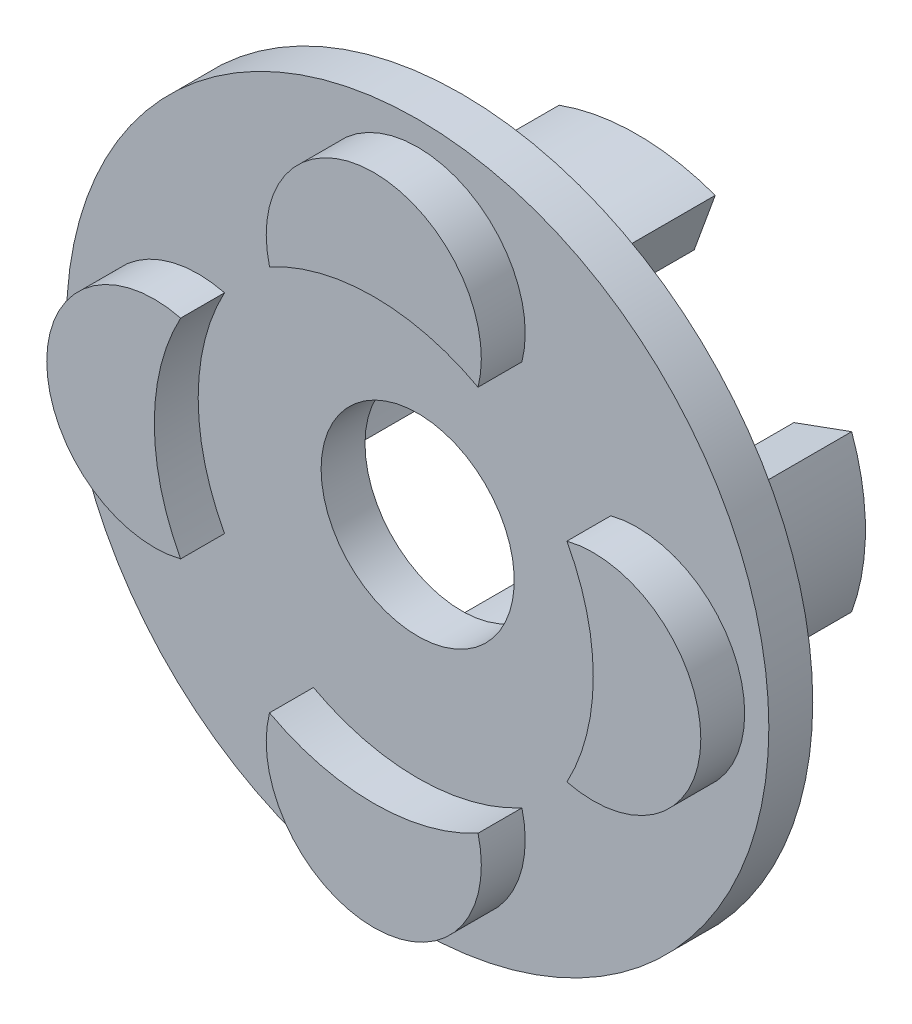
ISO-10303-21;
HEADER;
FILE_DESCRIPTION(('STEP AP214'),'2;1');
FILE_NAME('part.step','',(''),(''),'','','');
FILE_SCHEMA(('AUTOMOTIVE_DESIGN { 1 0 10303 214 1 1 1 1 }'));
ENDSEC;
DATA;
#1=APPLICATION_CONTEXT('core data for automotive mechanical design processes');
#2=APPLICATION_PROTOCOL_DEFINITION('international standard','automotive_design',2000,#1);
#3=PRODUCT_CONTEXT('',#1,'mechanical');
#4=PRODUCT('Part','Part','',(#3));
#5=PRODUCT_RELATED_PRODUCT_CATEGORY('part','',(#4));
#6=PRODUCT_DEFINITION_FORMATION('','',#4);
#7=PRODUCT_DEFINITION_CONTEXT('part definition',#1,'design');
#8=PRODUCT_DEFINITION('design','',#6,#7);
#9=PRODUCT_DEFINITION_SHAPE('','',#8);
#10=(LENGTH_UNIT() NAMED_UNIT(*) SI_UNIT(.MILLI.,.METRE.));
#11=(NAMED_UNIT(*) PLANE_ANGLE_UNIT() SI_UNIT($,.RADIAN.));
#12=(NAMED_UNIT(*) SI_UNIT($,.STERADIAN.) SOLID_ANGLE_UNIT());
#13=UNCERTAINTY_MEASURE_WITH_UNIT(LENGTH_MEASURE(1.E-05),#10,'distance_accuracy_value','');
#14=(GEOMETRIC_REPRESENTATION_CONTEXT(3) GLOBAL_UNCERTAINTY_ASSIGNED_CONTEXT((#13)) GLOBAL_UNIT_ASSIGNED_CONTEXT((#10,
#11,#12)) REPRESENTATION_CONTEXT('',''));
#15=CARTESIAN_POINT('',(0.,0.,0.));
#16=DIRECTION('',(0.,0.,1.));
#17=DIRECTION('',(1.,0.,0.));
#18=AXIS2_PLACEMENT_3D('',#15,#16,#17);
#19=CARTESIAN_POINT('',(0.,0.,0.));
#20=DIRECTION('',(0.,0.,1.));
#21=DIRECTION('',(1.,0.,0.));
#22=AXIS2_PLACEMENT_3D('',#19,#20,#21);
#23=PLANE('',#22);
#24=CARTESIAN_POINT('',(0.,0.,0.));
#25=DIRECTION('',(0.,0.,-1.));
#26=DIRECTION('',(-1.,0.,0.));
#27=AXIS2_PLACEMENT_3D('',#24,#25,#26);
#28=CIRCLE('',#27,11.);
#29=CARTESIAN_POINT('',(-11.,0.,0.));
#30=VERTEX_POINT('',#29);
#31=EDGE_CURVE('E286',#30,#30,#28,.T.);
#32=ORIENTED_EDGE('',*,*,#31,.F.);
#33=EDGE_LOOP('',(#32));
#34=FACE_BOUND('',#33,.T.);
#35=CARTESIAN_POINT('',(0.,0.,0.));
#36=DIRECTION('',(0.,0.,-1.));
#37=DIRECTION('',(-1.,0.,0.));
#38=AXIS2_PLACEMENT_3D('',#35,#36,#37);
#39=CIRCLE('',#38,26.);
#40=CARTESIAN_POINT('',(8.89252372646739,-24.4320081404336,0.));
#41=VERTEX_POINT('',#40);
#42=CARTESIAN_POINT('',(-8.89252372646741,-24.4320081404336,0.));
#43=VERTEX_POINT('',#42);
#44=EDGE_CURVE('E339',#41,#43,#39,.T.);
#45=ORIENTED_EDGE('',*,*,#44,.F.);
#46=DIRECTION('',(0.342020143325669,-0.939692620785908,0.));
#47=VECTOR('',#46,1.);
#48=CARTESIAN_POINT('',(6.49838272318771,-17.8541597949323,0.));
#49=LINE('',#48,#47);
#50=CARTESIAN_POINT('',(6.49838272318771,-17.8541597949323,0.));
#51=VERTEX_POINT('',#50);
#52=EDGE_CURVE('E345',#51,#41,#49,.T.);
#53=ORIENTED_EDGE('',*,*,#52,.F.);
#54=CARTESIAN_POINT('',(0.,0.,0.));
#55=DIRECTION('',(0.,0.,1.));
#56=DIRECTION('',(-1.,0.,0.));
#57=AXIS2_PLACEMENT_3D('',#54,#55,#56);
#58=CIRCLE('',#57,19.);
#59=CARTESIAN_POINT('',(-6.49838272318772,-17.8541597949323,0.));
#60=VERTEX_POINT('',#59);
#61=EDGE_CURVE('E362',#60,#51,#58,.T.);
#62=ORIENTED_EDGE('',*,*,#61,.F.);
#63=DIRECTION('',(0.342020143325669,0.939692620785908,0.));
#64=VECTOR('',#63,1.);
#65=CARTESIAN_POINT('',(-6.49838272318772,-17.8541597949323,0.));
#66=LINE('',#65,#64);
#67=EDGE_CURVE('E358',#43,#60,#66,.T.);
#68=ORIENTED_EDGE('',*,*,#67,.F.);
#69=EDGE_LOOP('',(#45,#53,#62,#68));
#70=FACE_BOUND('',#69,.T.);
#71=CARTESIAN_POINT('',(0.,0.,0.));
#72=DIRECTION('',(0.,0.,-1.));
#73=DIRECTION('',(-1.,0.,0.));
#74=AXIS2_PLACEMENT_3D('',#71,#72,#73);
#75=CIRCLE('',#74,26.);
#76=CARTESIAN_POINT('',(-8.8925237264674,24.4320081404336,0.));
#77=VERTEX_POINT('',#76);
#78=CARTESIAN_POINT('',(8.8925237264674,24.4320081404336,0.));
#79=VERTEX_POINT('',#78);
#80=EDGE_CURVE('E429',#77,#79,#75,.T.);
#81=ORIENTED_EDGE('',*,*,#80,.F.);
#82=DIRECTION('',(-0.342020143325669,0.939692620785908,0.));
#83=VECTOR('',#82,1.);
#84=CARTESIAN_POINT('',(-6.49838272318772,17.8541597949323,0.));
#85=LINE('',#84,#83);
#86=CARTESIAN_POINT('',(-6.49838272318771,17.8541597949323,0.));
#87=VERTEX_POINT('',#86);
#88=EDGE_CURVE('E435',#87,#77,#85,.T.);
#89=ORIENTED_EDGE('',*,*,#88,.F.);
#90=CARTESIAN_POINT('',(0.,0.,0.));
#91=DIRECTION('',(0.,0.,1.));
#92=DIRECTION('',(-1.,0.,0.));
#93=AXIS2_PLACEMENT_3D('',#90,#91,#92);
#94=CIRCLE('',#93,19.);
#95=CARTESIAN_POINT('',(6.49838272318772,17.8541597949323,0.));
#96=VERTEX_POINT('',#95);
#97=EDGE_CURVE('E452',#96,#87,#94,.T.);
#98=ORIENTED_EDGE('',*,*,#97,.F.);
#99=DIRECTION('',(-0.342020143325669,-0.939692620785908,0.));
#100=VECTOR('',#99,1.);
#101=CARTESIAN_POINT('',(6.49838272318772,17.8541597949323,0.));
#102=LINE('',#101,#100);
#103=EDGE_CURVE('E448',#79,#96,#102,.T.);
#104=ORIENTED_EDGE('',*,*,#103,.F.);
#105=EDGE_LOOP('',(#81,#89,#98,#104));
#106=FACE_BOUND('',#105,.T.);
#107=CARTESIAN_POINT('',(0.,0.,0.));
#108=DIRECTION('',(0.,0.,1.));
#109=DIRECTION('',(1.,0.,0.));
#110=AXIS2_PLACEMENT_3D('',#107,#108,#109);
#111=CIRCLE('',#110,40.);
#112=CARTESIAN_POINT('',(40.,0.,0.));
#113=VERTEX_POINT('',#112);
#114=EDGE_CURVE('E43',#113,#113,#111,.T.);
#115=ORIENTED_EDGE('',*,*,#114,.F.);
#116=EDGE_LOOP('',(#115));
#117=FACE_BOUND('',#116,.T.);
#118=CARTESIAN_POINT('',(0.,0.,0.));
#119=DIRECTION('',(0.,0.,-1.));
#120=DIRECTION('',(-1.,0.,0.));
#121=AXIS2_PLACEMENT_3D('',#118,#119,#120);
#122=CIRCLE('',#121,26.);
#123=CARTESIAN_POINT('',(-24.4320081404336,-8.8925237264674,0.));
#124=VERTEX_POINT('',#123);
#125=CARTESIAN_POINT('',(-24.4320081404336,8.8925237264674,0.));
#126=VERTEX_POINT('',#125);
#127=EDGE_CURVE('E384',#124,#126,#122,.T.);
#128=ORIENTED_EDGE('',*,*,#127,.F.);
#129=DIRECTION('',(-0.939692620785908,-0.342020143325669,0.));
#130=VECTOR('',#129,1.);
#131=CARTESIAN_POINT('',(-17.8541597949323,-6.49838272318772,0.));
#132=LINE('',#131,#130);
#133=CARTESIAN_POINT('',(-17.8541597949323,-6.49838272318771,0.));
#134=VERTEX_POINT('',#133);
#135=EDGE_CURVE('E390',#134,#124,#132,.T.);
#136=ORIENTED_EDGE('',*,*,#135,.F.);
#137=CARTESIAN_POINT('',(0.,0.,0.));
#138=DIRECTION('',(0.,0.,1.));
#139=DIRECTION('',(-1.,0.,0.));
#140=AXIS2_PLACEMENT_3D('',#137,#138,#139);
#141=CIRCLE('',#140,19.);
#142=CARTESIAN_POINT('',(-17.8541597949323,6.49838272318772,0.));
#143=VERTEX_POINT('',#142);
#144=EDGE_CURVE('E407',#143,#134,#141,.T.);
#145=ORIENTED_EDGE('',*,*,#144,.F.);
#146=DIRECTION('',(0.939692620785908,-0.342020143325669,0.));
#147=VECTOR('',#146,1.);
#148=CARTESIAN_POINT('',(-17.8541597949323,6.49838272318772,0.));
#149=LINE('',#148,#147);
#150=EDGE_CURVE('E403',#126,#143,#149,.T.);
#151=ORIENTED_EDGE('',*,*,#150,.F.);
#152=EDGE_LOOP('',(#128,#136,#145,#151));
#153=FACE_BOUND('',#152,.T.);
#154=CARTESIAN_POINT('',(0.,0.,0.));
#155=DIRECTION('',(0.,0.,-1.));
#156=DIRECTION('',(-1.,0.,0.));
#157=AXIS2_PLACEMENT_3D('',#154,#155,#156);
#158=CIRCLE('',#157,26.);
#159=CARTESIAN_POINT('',(24.4320081404336,8.8925237264674,0.));
#160=VERTEX_POINT('',#159);
#161=CARTESIAN_POINT('',(24.4320081404336,-8.8925237264674,0.));
#162=VERTEX_POINT('',#161);
#163=EDGE_CURVE('E291',#160,#162,#158,.T.);
#164=ORIENTED_EDGE('',*,*,#163,.F.);
#165=DIRECTION('',(0.939692620785908,0.342020143325669,0.));
#166=VECTOR('',#165,1.);
#167=CARTESIAN_POINT('',(17.8541597949323,6.49838272318772,0.));
#168=LINE('',#167,#166);
#169=CARTESIAN_POINT('',(17.8541597949323,6.49838272318771,0.));
#170=VERTEX_POINT('',#169);
#171=EDGE_CURVE('E300',#170,#160,#168,.T.);
#172=ORIENTED_EDGE('',*,*,#171,.F.);
#173=CARTESIAN_POINT('',(0.,0.,0.));
#174=DIRECTION('',(0.,0.,1.));
#175=DIRECTION('',(-1.,0.,0.));
#176=AXIS2_PLACEMENT_3D('',#173,#174,#175);
#177=CIRCLE('',#176,19.);
#178=CARTESIAN_POINT('',(17.8541597949323,-6.49838272318772,0.));
#179=VERTEX_POINT('',#178);
#180=EDGE_CURVE('E317',#179,#170,#177,.T.);
#181=ORIENTED_EDGE('',*,*,#180,.F.);
#182=DIRECTION('',(-0.939692620785908,0.342020143325669,0.));
#183=VECTOR('',#182,1.);
#184=CARTESIAN_POINT('',(17.8541597949323,-6.49838272318772,0.));
#185=LINE('',#184,#183);
#186=EDGE_CURVE('E313',#162,#179,#185,.T.);
#187=ORIENTED_EDGE('',*,*,#186,.F.);
#188=EDGE_LOOP('',(#164,#172,#181,#187));
#189=FACE_BOUND('',#188,.T.);
#190=ADVANCED_FACE('F39',(#34,#70,#106,#117,#153,#189),#23,.F.);
#191=CARTESIAN_POINT('',(0.,0.,5.));
#192=DIRECTION('',(0.,0.,-1.));
#193=DIRECTION('',(-1.,0.,0.));
#194=AXIS2_PLACEMENT_3D('',#191,#192,#193);
#195=CYLINDRICAL_SURFACE('',#194,40.);
#196=CARTESIAN_POINT('',(0.,0.,5.));
#197=DIRECTION('',(0.,0.,1.));
#198=DIRECTION('',(1.,0.,0.));
#199=AXIS2_PLACEMENT_3D('',#196,#197,#198);
#200=CIRCLE('',#199,40.);
#201=CARTESIAN_POINT('',(40.,0.,5.));
#202=VERTEX_POINT('',#201);
#203=EDGE_CURVE('E11',#202,#202,#200,.T.);
#204=ORIENTED_EDGE('',*,*,#203,.F.);
#205=EDGE_LOOP('',(#204));
#206=FACE_BOUND('',#205,.T.);
#207=ORIENTED_EDGE('',*,*,#114,.T.);
#208=EDGE_LOOP('',(#207));
#209=FACE_BOUND('',#208,.T.);
#210=ADVANCED_FACE('F41',(#206,#209),#195,.T.);
#211=CARTESIAN_POINT('',(0.,0.,5.));
#212=DIRECTION('',(0.,0.,1.));
#213=DIRECTION('',(1.,0.,0.));
#214=AXIS2_PLACEMENT_3D('',#211,#212,#213);
#215=PLANE('',#214);
#216=CARTESIAN_POINT('',(-25.,2.61861100413235E-13,5.));
#217=DIRECTION('',(0.,0.,1.));
#218=DIRECTION('',(1.,0.,0.));
#219=AXIS2_PLACEMENT_3D('',#216,#217,#218);
#220=CIRCLE('',#219,12.25);
#221=CARTESIAN_POINT('',(-21.9987499999999,11.8766577132418,5.));
#222=VERTEX_POINT('',#221);
#223=CARTESIAN_POINT('',(-21.9987500000001,-11.8766577132413,5.));
#224=VERTEX_POINT('',#223);
#225=EDGE_CURVE('E217',#222,#224,#220,.T.);
#226=ORIENTED_EDGE('',*,*,#225,.F.);
#227=CARTESIAN_POINT('',(0.,0.,5.));
#228=DIRECTION('',(0.,0.,-1.));
#229=DIRECTION('',(-1.,0.,0.));
#230=AXIS2_PLACEMENT_3D('',#227,#228,#229);
#231=CIRCLE('',#230,25.);
#232=EDGE_CURVE('E55',#224,#222,#231,.T.);
#233=ORIENTED_EDGE('',*,*,#232,.F.);
#234=EDGE_LOOP('',(#226,#233));
#235=FACE_BOUND('',#234,.T.);
#236=CARTESIAN_POINT('',(-1.74574066942157E-13,-25.,5.));
#237=DIRECTION('',(0.,0.,1.));
#238=DIRECTION('',(1.,0.,0.));
#239=AXIS2_PLACEMENT_3D('',#236,#237,#238);
#240=CIRCLE('',#239,12.25);
#241=CARTESIAN_POINT('',(-11.8766577132417,-21.9987499999999,5.));
#242=VERTEX_POINT('',#241);
#243=CARTESIAN_POINT('',(11.8766577132414,-21.9987500000001,5.));
#244=VERTEX_POINT('',#243);
#245=EDGE_CURVE('E224',#242,#244,#240,.T.);
#246=ORIENTED_EDGE('',*,*,#245,.F.);
#247=CARTESIAN_POINT('',(0.,0.,5.));
#248=DIRECTION('',(0.,0.,-1.));
#249=DIRECTION('',(-1.,0.,0.));
#250=AXIS2_PLACEMENT_3D('',#247,#248,#249);
#251=CIRCLE('',#250,25.);
#252=EDGE_CURVE('E63',#244,#242,#251,.T.);
#253=ORIENTED_EDGE('',*,*,#252,.F.);
#254=EDGE_LOOP('',(#246,#253));
#255=FACE_BOUND('',#254,.T.);
#256=CARTESIAN_POINT('',(25.,0.,5.));
#257=DIRECTION('',(0.,0.,1.));
#258=DIRECTION('',(1.,0.,0.));
#259=AXIS2_PLACEMENT_3D('',#256,#257,#258);
#260=CIRCLE('',#259,12.25);
#261=CARTESIAN_POINT('',(21.99875,-11.8766577132416,5.));
#262=VERTEX_POINT('',#261);
#263=CARTESIAN_POINT('',(21.99875,11.8766577132415,5.));
#264=VERTEX_POINT('',#263);
#265=EDGE_CURVE('E250',#262,#264,#260,.T.);
#266=ORIENTED_EDGE('',*,*,#265,.F.);
#267=CARTESIAN_POINT('',(0.,0.,5.));
#268=DIRECTION('',(0.,0.,-1.));
#269=DIRECTION('',(-1.,0.,0.));
#270=AXIS2_PLACEMENT_3D('',#267,#268,#269);
#271=CIRCLE('',#270,25.);
#272=EDGE_CURVE('E244',#264,#262,#271,.T.);
#273=ORIENTED_EDGE('',*,*,#272,.F.);
#274=EDGE_LOOP('',(#266,#273));
#275=FACE_BOUND('',#274,.T.);
#276=CARTESIAN_POINT('',(0.,25.,5.));
#277=DIRECTION('',(0.,0.,1.));
#278=DIRECTION('',(1.,0.,0.));
#279=AXIS2_PLACEMENT_3D('',#276,#277,#278);
#280=CIRCLE('',#279,12.25);
#281=CARTESIAN_POINT('',(11.8766577132415,21.99875,5.));
#282=VERTEX_POINT('',#281);
#283=CARTESIAN_POINT('',(-11.8766577132416,21.99875,5.));
#284=VERTEX_POINT('',#283);
#285=EDGE_CURVE('E271',#282,#284,#280,.T.);
#286=ORIENTED_EDGE('',*,*,#285,.F.);
#287=CARTESIAN_POINT('',(0.,0.,5.));
#288=DIRECTION('',(0.,0.,-1.));
#289=DIRECTION('',(-1.,0.,0.));
#290=AXIS2_PLACEMENT_3D('',#287,#288,#289);
#291=CIRCLE('',#290,25.);
#292=EDGE_CURVE('E265',#284,#282,#291,.T.);
#293=ORIENTED_EDGE('',*,*,#292,.F.);
#294=EDGE_LOOP('',(#286,#293));
#295=FACE_BOUND('',#294,.T.);
#296=CARTESIAN_POINT('',(0.,0.,5.));
#297=DIRECTION('',(0.,0.,-1.));
#298=DIRECTION('',(-1.,0.,0.));
#299=AXIS2_PLACEMENT_3D('',#296,#297,#298);
#300=CIRCLE('',#299,11.);
#301=CARTESIAN_POINT('',(-11.,0.,5.));
#302=VERTEX_POINT('',#301);
#303=EDGE_CURVE('E287',#302,#302,#300,.T.);
#304=ORIENTED_EDGE('',*,*,#303,.T.);
#305=EDGE_LOOP('',(#304));
#306=FACE_BOUND('',#305,.T.);
#307=ORIENTED_EDGE('',*,*,#203,.T.);
#308=EDGE_LOOP('',(#307));
#309=FACE_BOUND('',#308,.T.);
#310=ADVANCED_FACE('F569',(#235,#255,#275,#295,#306,#309),#215,.T.);
#311=CARTESIAN_POINT('',(0.,0.,-20.));
#312=DIRECTION('',(0.,0.,1.));
#313=DIRECTION('',(1.,0.,0.));
#314=AXIS2_PLACEMENT_3D('',#311,#312,#313);
#315=CYLINDRICAL_SURFACE('',#314,26.);
#316=ORIENTED_EDGE('',*,*,#80,.T.);
#317=DIRECTION('',(0.,0.,1.));
#318=VECTOR('',#317,1.);
#319=CARTESIAN_POINT('',(8.8925237264674,24.4320081404336,-20.));
#320=LINE('',#319,#318);
#321=CARTESIAN_POINT('',(8.8925237264674,24.4320081404336,-20.));
#322=VERTEX_POINT('',#321);
#323=EDGE_CURVE('E470',#322,#79,#320,.T.);
#324=ORIENTED_EDGE('',*,*,#323,.F.);
#325=CARTESIAN_POINT('',(0.,0.,-20.));
#326=DIRECTION('',(0.,0.,-1.));
#327=DIRECTION('',(-1.,0.,0.));
#328=AXIS2_PLACEMENT_3D('',#325,#326,#327);
#329=CIRCLE('',#328,26.);
#330=CARTESIAN_POINT('',(-8.8925237264674,24.4320081404336,-20.));
#331=VERTEX_POINT('',#330);
#332=EDGE_CURVE('E430',#331,#322,#329,.T.);
#333=ORIENTED_EDGE('',*,*,#332,.F.);
#334=DIRECTION('',(0.,0.,1.));
#335=VECTOR('',#334,1.);
#336=CARTESIAN_POINT('',(-8.8925237264674,24.4320081404336,-20.));
#337=LINE('',#336,#335);
#338=EDGE_CURVE('E444',#331,#77,#337,.T.);
#339=ORIENTED_EDGE('',*,*,#338,.T.);
#340=EDGE_LOOP('',(#316,#324,#333,#339));
#341=FACE_BOUND('',#340,.T.);
#342=ADVANCED_FACE('F566',(#341),#315,.T.);
#343=CARTESIAN_POINT('',(6.49838272318772,17.8541597949323,-20.));
#344=DIRECTION('',(-0.939692620785908,0.342020143325669,0.));
#345=DIRECTION('',(-0.342020143325669,-0.939692620785908,0.));
#346=AXIS2_PLACEMENT_3D('',#343,#344,#345);
#347=PLANE('',#346);
#348=ORIENTED_EDGE('',*,*,#103,.T.);
#349=DIRECTION('',(0.,0.,1.));
#350=VECTOR('',#349,1.);
#351=CARTESIAN_POINT('',(6.49838272318772,17.8541597949323,-20.));
#352=LINE('',#351,#350);
#353=CARTESIAN_POINT('',(6.49838272318772,17.8541597949323,-20.));
#354=VERTEX_POINT('',#353);
#355=EDGE_CURVE('E466',#354,#96,#352,.T.);
#356=ORIENTED_EDGE('',*,*,#355,.F.);
#357=DIRECTION('',(-0.342020143325669,-0.939692620785908,0.));
#358=VECTOR('',#357,1.);
#359=CARTESIAN_POINT('',(6.49838272318772,17.8541597949323,-20.));
#360=LINE('',#359,#358);
#361=EDGE_CURVE('E434',#322,#354,#360,.T.);
#362=ORIENTED_EDGE('',*,*,#361,.F.);
#363=ORIENTED_EDGE('',*,*,#323,.T.);
#364=EDGE_LOOP('',(#348,#356,#362,#363));
#365=FACE_BOUND('',#364,.T.);
#366=ADVANCED_FACE('F562',(#365),#347,.F.);
#367=CARTESIAN_POINT('',(0.,0.,-20.));
#368=DIRECTION('',(0.,0.,1.));
#369=DIRECTION('',(1.,0.,0.));
#370=AXIS2_PLACEMENT_3D('',#367,#368,#369);
#371=CYLINDRICAL_SURFACE('',#370,19.);
#372=ORIENTED_EDGE('',*,*,#97,.T.);
#373=DIRECTION('',(0.,0.,1.));
#374=VECTOR('',#373,1.);
#375=CARTESIAN_POINT('',(-6.49838272318772,17.8541597949323,-20.));
#376=LINE('',#375,#374);
#377=CARTESIAN_POINT('',(-6.49838272318772,17.8541597949323,-20.));
#378=VERTEX_POINT('',#377);
#379=EDGE_CURVE('E462',#378,#87,#376,.T.);
#380=ORIENTED_EDGE('',*,*,#379,.F.);
#381=CARTESIAN_POINT('',(0.,0.,-20.));
#382=DIRECTION('',(0.,0.,1.));
#383=DIRECTION('',(-1.,0.,0.));
#384=AXIS2_PLACEMENT_3D('',#381,#382,#383);
#385=CIRCLE('',#384,19.);
#386=EDGE_CURVE('E438',#354,#378,#385,.T.);
#387=ORIENTED_EDGE('',*,*,#386,.F.);
#388=ORIENTED_EDGE('',*,*,#355,.T.);
#389=EDGE_LOOP('',(#372,#380,#387,#388));
#390=FACE_BOUND('',#389,.T.);
#391=ADVANCED_FACE('F558',(#390),#371,.F.);
#392=CARTESIAN_POINT('',(-6.49838272318772,17.8541597949323,-20.));
#393=DIRECTION('',(0.939692620785908,0.342020143325669,0.));
#394=DIRECTION('',(-0.342020143325669,0.939692620785908,0.));
#395=AXIS2_PLACEMENT_3D('',#392,#393,#394);
#396=PLANE('',#395);
#397=ORIENTED_EDGE('',*,*,#88,.T.);
#398=ORIENTED_EDGE('',*,*,#338,.F.);
#399=DIRECTION('',(-0.342020143325669,0.939692620785908,0.));
#400=VECTOR('',#399,1.);
#401=CARTESIAN_POINT('',(-6.49838272318772,17.8541597949323,-20.));
#402=LINE('',#401,#400);
#403=EDGE_CURVE('E441',#378,#331,#402,.T.);
#404=ORIENTED_EDGE('',*,*,#403,.F.);
#405=ORIENTED_EDGE('',*,*,#379,.T.);
#406=EDGE_LOOP('',(#397,#398,#404,#405));
#407=FACE_BOUND('',#406,.T.);
#408=ADVANCED_FACE('F554',(#407),#396,.F.);
#409=CARTESIAN_POINT('',(0.,0.,-20.));
#410=DIRECTION('',(0.,0.,-1.));
#411=DIRECTION('',(-1.,0.,0.));
#412=AXIS2_PLACEMENT_3D('',#409,#410,#411);
#413=PLANE('',#412);
#414=ORIENTED_EDGE('',*,*,#332,.T.);
#415=ORIENTED_EDGE('',*,*,#361,.T.);
#416=ORIENTED_EDGE('',*,*,#386,.T.);
#417=ORIENTED_EDGE('',*,*,#403,.T.);
#418=EDGE_LOOP('',(#414,#415,#416,#417));
#419=FACE_BOUND('',#418,.T.);
#420=ADVANCED_FACE('F550',(#419),#413,.T.);
#421=CARTESIAN_POINT('',(0.,0.,-20.));
#422=DIRECTION('',(0.,0.,1.));
#423=DIRECTION('',(1.,0.,0.));
#424=AXIS2_PLACEMENT_3D('',#421,#422,#423);
#425=CYLINDRICAL_SURFACE('',#424,26.);
#426=ORIENTED_EDGE('',*,*,#127,.T.);
#427=DIRECTION('',(0.,0.,1.));
#428=VECTOR('',#427,1.);
#429=CARTESIAN_POINT('',(-24.4320081404336,8.8925237264674,-20.));
#430=LINE('',#429,#428);
#431=CARTESIAN_POINT('',(-24.4320081404336,8.8925237264674,-20.));
#432=VERTEX_POINT('',#431);
#433=EDGE_CURVE('E425',#432,#126,#430,.T.);
#434=ORIENTED_EDGE('',*,*,#433,.F.);
#435=CARTESIAN_POINT('',(0.,0.,-20.));
#436=DIRECTION('',(0.,0.,-1.));
#437=DIRECTION('',(-1.,0.,0.));
#438=AXIS2_PLACEMENT_3D('',#435,#436,#437);
#439=CIRCLE('',#438,26.);
#440=CARTESIAN_POINT('',(-24.4320081404336,-8.8925237264674,-20.));
#441=VERTEX_POINT('',#440);
#442=EDGE_CURVE('E385',#441,#432,#439,.T.);
#443=ORIENTED_EDGE('',*,*,#442,.F.);
#444=DIRECTION('',(0.,0.,1.));
#445=VECTOR('',#444,1.);
#446=CARTESIAN_POINT('',(-24.4320081404336,-8.8925237264674,-20.));
#447=LINE('',#446,#445);
#448=EDGE_CURVE('E399',#441,#124,#447,.T.);
#449=ORIENTED_EDGE('',*,*,#448,.T.);
#450=EDGE_LOOP('',(#426,#434,#443,#449));
#451=FACE_BOUND('',#450,.T.);
#452=ADVANCED_FACE('F546',(#451),#425,.T.);
#453=CARTESIAN_POINT('',(-17.8541597949323,6.49838272318772,-20.));
#454=DIRECTION('',(-0.342020143325669,-0.939692620785908,0.));
#455=DIRECTION('',(0.939692620785908,-0.342020143325669,0.));
#456=AXIS2_PLACEMENT_3D('',#453,#454,#455);
#457=PLANE('',#456);
#458=ORIENTED_EDGE('',*,*,#150,.T.);
#459=DIRECTION('',(0.,0.,1.));
#460=VECTOR('',#459,1.);
#461=CARTESIAN_POINT('',(-17.8541597949323,6.49838272318772,-20.));
#462=LINE('',#461,#460);
#463=CARTESIAN_POINT('',(-17.8541597949323,6.49838272318772,-20.));
#464=VERTEX_POINT('',#463);
#465=EDGE_CURVE('E421',#464,#143,#462,.T.);
#466=ORIENTED_EDGE('',*,*,#465,.F.);
#467=DIRECTION('',(0.939692620785908,-0.342020143325669,0.));
#468=VECTOR('',#467,1.);
#469=CARTESIAN_POINT('',(-17.8541597949323,6.49838272318772,-20.));
#470=LINE('',#469,#468);
#471=EDGE_CURVE('E389',#432,#464,#470,.T.);
#472=ORIENTED_EDGE('',*,*,#471,.F.);
#473=ORIENTED_EDGE('',*,*,#433,.T.);
#474=EDGE_LOOP('',(#458,#466,#472,#473));
#475=FACE_BOUND('',#474,.T.);
#476=ADVANCED_FACE('F542',(#475),#457,.F.);
#477=CARTESIAN_POINT('',(0.,0.,-20.));
#478=DIRECTION('',(0.,0.,1.));
#479=DIRECTION('',(1.,0.,0.));
#480=AXIS2_PLACEMENT_3D('',#477,#478,#479);
#481=CYLINDRICAL_SURFACE('',#480,19.);
#482=ORIENTED_EDGE('',*,*,#144,.T.);
#483=DIRECTION('',(0.,0.,1.));
#484=VECTOR('',#483,1.);
#485=CARTESIAN_POINT('',(-17.8541597949323,-6.49838272318772,-20.));
#486=LINE('',#485,#484);
#487=CARTESIAN_POINT('',(-17.8541597949323,-6.49838272318772,-20.));
#488=VERTEX_POINT('',#487);
#489=EDGE_CURVE('E417',#488,#134,#486,.T.);
#490=ORIENTED_EDGE('',*,*,#489,.F.);
#491=CARTESIAN_POINT('',(0.,0.,-20.));
#492=DIRECTION('',(0.,0.,1.));
#493=DIRECTION('',(-1.,0.,0.));
#494=AXIS2_PLACEMENT_3D('',#491,#492,#493);
#495=CIRCLE('',#494,19.);
#496=EDGE_CURVE('E393',#464,#488,#495,.T.);
#497=ORIENTED_EDGE('',*,*,#496,.F.);
#498=ORIENTED_EDGE('',*,*,#465,.T.);
#499=EDGE_LOOP('',(#482,#490,#497,#498));
#500=FACE_BOUND('',#499,.T.);
#501=ADVANCED_FACE('F538',(#500),#481,.F.);
#502=CARTESIAN_POINT('',(-17.8541597949323,-6.49838272318772,-20.));
#503=DIRECTION('',(-0.342020143325669,0.939692620785908,0.));
#504=DIRECTION('',(-0.939692620785908,-0.342020143325669,0.));
#505=AXIS2_PLACEMENT_3D('',#502,#503,#504);
#506=PLANE('',#505);
#507=ORIENTED_EDGE('',*,*,#135,.T.);
#508=ORIENTED_EDGE('',*,*,#448,.F.);
#509=DIRECTION('',(-0.939692620785908,-0.342020143325669,0.));
#510=VECTOR('',#509,1.);
#511=CARTESIAN_POINT('',(-17.8541597949323,-6.49838272318772,-20.));
#512=LINE('',#511,#510);
#513=EDGE_CURVE('E396',#488,#441,#512,.T.);
#514=ORIENTED_EDGE('',*,*,#513,.F.);
#515=ORIENTED_EDGE('',*,*,#489,.T.);
#516=EDGE_LOOP('',(#507,#508,#514,#515));
#517=FACE_BOUND('',#516,.T.);
#518=ADVANCED_FACE('F534',(#517),#506,.F.);
#519=CARTESIAN_POINT('',(0.,0.,-20.));
#520=DIRECTION('',(0.,0.,-1.));
#521=DIRECTION('',(-1.,0.,0.));
#522=AXIS2_PLACEMENT_3D('',#519,#520,#521);
#523=PLANE('',#522);
#524=ORIENTED_EDGE('',*,*,#442,.T.);
#525=ORIENTED_EDGE('',*,*,#471,.T.);
#526=ORIENTED_EDGE('',*,*,#496,.T.);
#527=ORIENTED_EDGE('',*,*,#513,.T.);
#528=EDGE_LOOP('',(#524,#525,#526,#527));
#529=FACE_BOUND('',#528,.T.);
#530=ADVANCED_FACE('F530',(#529),#523,.T.);
#531=CARTESIAN_POINT('',(0.,0.,-20.));
#532=DIRECTION('',(0.,0.,1.));
#533=DIRECTION('',(1.,0.,0.));
#534=AXIS2_PLACEMENT_3D('',#531,#532,#533);
#535=CYLINDRICAL_SURFACE('',#534,26.);
#536=ORIENTED_EDGE('',*,*,#44,.T.);
#537=DIRECTION('',(0.,0.,1.));
#538=VECTOR('',#537,1.);
#539=CARTESIAN_POINT('',(-8.89252372646741,-24.4320081404336,-20.));
#540=LINE('',#539,#538);
#541=CARTESIAN_POINT('',(-8.89252372646741,-24.4320081404336,-20.));
#542=VERTEX_POINT('',#541);
#543=EDGE_CURVE('E380',#542,#43,#540,.T.);
#544=ORIENTED_EDGE('',*,*,#543,.F.);
#545=CARTESIAN_POINT('',(0.,0.,-20.));
#546=DIRECTION('',(0.,0.,-1.));
#547=DIRECTION('',(-1.,0.,0.));
#548=AXIS2_PLACEMENT_3D('',#545,#546,#547);
#549=CIRCLE('',#548,26.);
#550=CARTESIAN_POINT('',(8.89252372646739,-24.4320081404336,-20.));
#551=VERTEX_POINT('',#550);
#552=EDGE_CURVE('E340',#551,#542,#549,.T.);
#553=ORIENTED_EDGE('',*,*,#552,.F.);
#554=DIRECTION('',(0.,0.,1.));
#555=VECTOR('',#554,1.);
#556=CARTESIAN_POINT('',(8.89252372646739,-24.4320081404336,-20.));
#557=LINE('',#556,#555);
#558=EDGE_CURVE('E354',#551,#41,#557,.T.);
#559=ORIENTED_EDGE('',*,*,#558,.T.);
#560=EDGE_LOOP('',(#536,#544,#553,#559));
#561=FACE_BOUND('',#560,.T.);
#562=ADVANCED_FACE('F526',(#561),#535,.T.);
#563=CARTESIAN_POINT('',(-6.49838272318772,-17.8541597949323,-20.));
#564=DIRECTION('',(0.939692620785908,-0.342020143325669,0.));
#565=DIRECTION('',(0.342020143325669,0.939692620785908,0.));
#566=AXIS2_PLACEMENT_3D('',#563,#564,#565);
#567=PLANE('',#566);
#568=ORIENTED_EDGE('',*,*,#67,.T.);
#569=DIRECTION('',(0.,0.,1.));
#570=VECTOR('',#569,1.);
#571=CARTESIAN_POINT('',(-6.49838272318772,-17.8541597949323,-20.));
#572=LINE('',#571,#570);
#573=CARTESIAN_POINT('',(-6.49838272318772,-17.8541597949323,-20.));
#574=VERTEX_POINT('',#573);
#575=EDGE_CURVE('E376',#574,#60,#572,.T.);
#576=ORIENTED_EDGE('',*,*,#575,.F.);
#577=DIRECTION('',(0.342020143325669,0.939692620785908,0.));
#578=VECTOR('',#577,1.);
#579=CARTESIAN_POINT('',(-6.49838272318772,-17.8541597949323,-20.));
#580=LINE('',#579,#578);
#581=EDGE_CURVE('E344',#542,#574,#580,.T.);
#582=ORIENTED_EDGE('',*,*,#581,.F.);
#583=ORIENTED_EDGE('',*,*,#543,.T.);
#584=EDGE_LOOP('',(#568,#576,#582,#583));
#585=FACE_BOUND('',#584,.T.);
#586=ADVANCED_FACE('F522',(#585),#567,.F.);
#587=CARTESIAN_POINT('',(0.,0.,-20.));
#588=DIRECTION('',(0.,0.,1.));
#589=DIRECTION('',(1.,0.,0.));
#590=AXIS2_PLACEMENT_3D('',#587,#588,#589);
#591=CYLINDRICAL_SURFACE('',#590,19.);
#592=ORIENTED_EDGE('',*,*,#61,.T.);
#593=DIRECTION('',(0.,0.,1.));
#594=VECTOR('',#593,1.);
#595=CARTESIAN_POINT('',(6.49838272318772,-17.8541597949323,-20.));
#596=LINE('',#595,#594);
#597=CARTESIAN_POINT('',(6.49838272318772,-17.8541597949323,-20.));
#598=VERTEX_POINT('',#597);
#599=EDGE_CURVE('E372',#598,#51,#596,.T.);
#600=ORIENTED_EDGE('',*,*,#599,.F.);
#601=CARTESIAN_POINT('',(0.,0.,-20.));
#602=DIRECTION('',(0.,0.,1.));
#603=DIRECTION('',(-1.,0.,0.));
#604=AXIS2_PLACEMENT_3D('',#601,#602,#603);
#605=CIRCLE('',#604,19.);
#606=EDGE_CURVE('E348',#574,#598,#605,.T.);
#607=ORIENTED_EDGE('',*,*,#606,.F.);
#608=ORIENTED_EDGE('',*,*,#575,.T.);
#609=EDGE_LOOP('',(#592,#600,#607,#608));
#610=FACE_BOUND('',#609,.T.);
#611=ADVANCED_FACE('F518',(#610),#591,.F.);
#612=CARTESIAN_POINT('',(6.49838272318771,-17.8541597949323,-20.));
#613=DIRECTION('',(-0.939692620785908,-0.342020143325669,0.));
#614=DIRECTION('',(0.342020143325669,-0.939692620785908,0.));
#615=AXIS2_PLACEMENT_3D('',#612,#613,#614);
#616=PLANE('',#615);
#617=ORIENTED_EDGE('',*,*,#52,.T.);
#618=ORIENTED_EDGE('',*,*,#558,.F.);
#619=DIRECTION('',(0.342020143325669,-0.939692620785908,0.));
#620=VECTOR('',#619,1.);
#621=CARTESIAN_POINT('',(6.49838272318771,-17.8541597949323,-20.));
#622=LINE('',#621,#620);
#623=EDGE_CURVE('E351',#598,#551,#622,.T.);
#624=ORIENTED_EDGE('',*,*,#623,.F.);
#625=ORIENTED_EDGE('',*,*,#599,.T.);
#626=EDGE_LOOP('',(#617,#618,#624,#625));
#627=FACE_BOUND('',#626,.T.);
#628=ADVANCED_FACE('F514',(#627),#616,.F.);
#629=CARTESIAN_POINT('',(0.,0.,-20.));
#630=DIRECTION('',(0.,0.,-1.));
#631=DIRECTION('',(-1.,0.,0.));
#632=AXIS2_PLACEMENT_3D('',#629,#630,#631);
#633=PLANE('',#632);
#634=ORIENTED_EDGE('',*,*,#552,.T.);
#635=ORIENTED_EDGE('',*,*,#581,.T.);
#636=ORIENTED_EDGE('',*,*,#606,.T.);
#637=ORIENTED_EDGE('',*,*,#623,.T.);
#638=EDGE_LOOP('',(#634,#635,#636,#637));
#639=FACE_BOUND('',#638,.T.);
#640=ADVANCED_FACE('F508',(#639),#633,.T.);
#641=CARTESIAN_POINT('',(0.,0.,-20.));
#642=DIRECTION('',(0.,0.,1.));
#643=DIRECTION('',(1.,0.,0.));
#644=AXIS2_PLACEMENT_3D('',#641,#642,#643);
#645=CYLINDRICAL_SURFACE('',#644,26.);
#646=ORIENTED_EDGE('',*,*,#163,.T.);
#647=DIRECTION('',(0.,0.,1.));
#648=VECTOR('',#647,1.);
#649=CARTESIAN_POINT('',(24.4320081404336,-8.89252372646741,-20.));
#650=LINE('',#649,#648);
#651=CARTESIAN_POINT('',(24.4320081404336,-8.89252372646741,-20.));
#652=VERTEX_POINT('',#651);
#653=EDGE_CURVE('E335',#652,#162,#650,.T.);
#654=ORIENTED_EDGE('',*,*,#653,.F.);
#655=CARTESIAN_POINT('',(0.,0.,-20.));
#656=DIRECTION('',(0.,0.,-1.));
#657=DIRECTION('',(-1.,0.,0.));
#658=AXIS2_PLACEMENT_3D('',#655,#656,#657);
#659=CIRCLE('',#658,26.);
#660=CARTESIAN_POINT('',(24.4320081404336,8.8925237264674,-20.));
#661=VERTEX_POINT('',#660);
#662=EDGE_CURVE('E295',#661,#652,#659,.T.);
#663=ORIENTED_EDGE('',*,*,#662,.F.);
#664=DIRECTION('',(0.,0.,1.));
#665=VECTOR('',#664,1.);
#666=CARTESIAN_POINT('',(24.4320081404336,8.8925237264674,-20.));
#667=LINE('',#666,#665);
#668=EDGE_CURVE('E309',#661,#160,#667,.T.);
#669=ORIENTED_EDGE('',*,*,#668,.T.);
#670=EDGE_LOOP('',(#646,#654,#663,#669));
#671=FACE_BOUND('',#670,.T.);
#672=ADVANCED_FACE('F492',(#671),#645,.T.);
#673=CARTESIAN_POINT('',(17.8541597949323,-6.49838272318772,-20.));
#674=DIRECTION('',(0.342020143325669,0.939692620785908,0.));
#675=DIRECTION('',(-0.939692620785908,0.342020143325669,0.));
#676=AXIS2_PLACEMENT_3D('',#673,#674,#675);
#677=PLANE('',#676);
#678=ORIENTED_EDGE('',*,*,#186,.T.);
#679=DIRECTION('',(0.,0.,1.));
#680=VECTOR('',#679,1.);
#681=CARTESIAN_POINT('',(17.8541597949323,-6.49838272318772,-20.));
#682=LINE('',#681,#680);
#683=CARTESIAN_POINT('',(17.8541597949323,-6.49838272318772,-20.));
#684=VERTEX_POINT('',#683);
#685=EDGE_CURVE('E331',#684,#179,#682,.T.);
#686=ORIENTED_EDGE('',*,*,#685,.F.);
#687=DIRECTION('',(-0.939692620785908,0.342020143325669,0.));
#688=VECTOR('',#687,1.);
#689=CARTESIAN_POINT('',(17.8541597949323,-6.49838272318772,-20.));
#690=LINE('',#689,#688);
#691=EDGE_CURVE('E299',#652,#684,#690,.T.);
#692=ORIENTED_EDGE('',*,*,#691,.F.);
#693=ORIENTED_EDGE('',*,*,#653,.T.);
#694=EDGE_LOOP('',(#678,#686,#692,#693));
#695=FACE_BOUND('',#694,.T.);
#696=ADVANCED_FACE('F500',(#695),#677,.F.);
#697=CARTESIAN_POINT('',(0.,0.,-20.));
#698=DIRECTION('',(0.,0.,1.));
#699=DIRECTION('',(1.,0.,0.));
#700=AXIS2_PLACEMENT_3D('',#697,#698,#699);
#701=CYLINDRICAL_SURFACE('',#700,19.);
#702=ORIENTED_EDGE('',*,*,#180,.T.);
#703=DIRECTION('',(0.,0.,1.));
#704=VECTOR('',#703,1.);
#705=CARTESIAN_POINT('',(17.8541597949323,6.49838272318772,-20.));
#706=LINE('',#705,#704);
#707=CARTESIAN_POINT('',(17.8541597949323,6.49838272318772,-20.));
#708=VERTEX_POINT('',#707);
#709=EDGE_CURVE('E327',#708,#170,#706,.T.);
#710=ORIENTED_EDGE('',*,*,#709,.F.);
#711=CARTESIAN_POINT('',(0.,0.,-20.));
#712=DIRECTION('',(0.,0.,1.));
#713=DIRECTION('',(-1.,0.,0.));
#714=AXIS2_PLACEMENT_3D('',#711,#712,#713);
#715=CIRCLE('',#714,19.);
#716=EDGE_CURVE('E303',#684,#708,#715,.T.);
#717=ORIENTED_EDGE('',*,*,#716,.F.);
#718=ORIENTED_EDGE('',*,*,#685,.T.);
#719=EDGE_LOOP('',(#702,#710,#717,#718));
#720=FACE_BOUND('',#719,.T.);
#721=ADVANCED_FACE('F498',(#720),#701,.F.);
#722=CARTESIAN_POINT('',(17.8541597949323,6.49838272318772,-20.));
#723=DIRECTION('',(0.342020143325669,-0.939692620785908,0.));
#724=DIRECTION('',(0.939692620785908,0.342020143325669,0.));
#725=AXIS2_PLACEMENT_3D('',#722,#723,#724);
#726=PLANE('',#725);
#727=ORIENTED_EDGE('',*,*,#171,.T.);
#728=ORIENTED_EDGE('',*,*,#668,.F.);
#729=DIRECTION('',(0.939692620785908,0.342020143325669,0.));
#730=VECTOR('',#729,1.);
#731=CARTESIAN_POINT('',(17.8541597949323,6.49838272318772,-20.));
#732=LINE('',#731,#730);
#733=EDGE_CURVE('E306',#708,#661,#732,.T.);
#734=ORIENTED_EDGE('',*,*,#733,.F.);
#735=ORIENTED_EDGE('',*,*,#709,.T.);
#736=EDGE_LOOP('',(#727,#728,#734,#735));
#737=FACE_BOUND('',#736,.T.);
#738=ADVANCED_FACE('F488',(#737),#726,.F.);
#739=CARTESIAN_POINT('',(0.,0.,-20.));
#740=DIRECTION('',(0.,0.,-1.));
#741=DIRECTION('',(-1.,0.,0.));
#742=AXIS2_PLACEMENT_3D('',#739,#740,#741);
#743=PLANE('',#742);
#744=ORIENTED_EDGE('',*,*,#662,.T.);
#745=ORIENTED_EDGE('',*,*,#691,.T.);
#746=ORIENTED_EDGE('',*,*,#716,.T.);
#747=ORIENTED_EDGE('',*,*,#733,.T.);
#748=EDGE_LOOP('',(#744,#745,#746,#747));
#749=FACE_BOUND('',#748,.T.);
#750=ADVANCED_FACE('F494',(#749),#743,.T.);
#751=CARTESIAN_POINT('',(0.,0.,5.));
#752=DIRECTION('',(0.,0.,-1.));
#753=DIRECTION('',(-1.,0.,0.));
#754=AXIS2_PLACEMENT_3D('',#751,#752,#753);
#755=CYLINDRICAL_SURFACE('',#754,11.);
#756=ORIENTED_EDGE('',*,*,#303,.F.);
#757=EDGE_LOOP('',(#756));
#758=FACE_BOUND('',#757,.T.);
#759=ORIENTED_EDGE('',*,*,#31,.T.);
#760=EDGE_LOOP('',(#759));
#761=FACE_BOUND('',#760,.T.);
#762=ADVANCED_FACE('F590',(#758,#761),#755,.F.);
#763=CARTESIAN_POINT('',(0.,0.,10.));
#764=DIRECTION('',(0.,0.,-1.));
#765=DIRECTION('',(-1.,0.,0.));
#766=AXIS2_PLACEMENT_3D('',#763,#764,#765);
#767=CYLINDRICAL_SURFACE('',#766,25.);
#768=ORIENTED_EDGE('',*,*,#292,.T.);
#769=DIRECTION('',(0.,0.,-1.));
#770=VECTOR('',#769,1.);
#771=CARTESIAN_POINT('',(11.8766577132416,21.99875,10.));
#772=LINE('',#771,#770);
#773=CARTESIAN_POINT('',(11.8766577132416,21.99875,10.));
#774=VERTEX_POINT('',#773);
#775=EDGE_CURVE('E282',#774,#282,#772,.T.);
#776=ORIENTED_EDGE('',*,*,#775,.F.);
#777=CARTESIAN_POINT('',(0.,0.,10.));
#778=DIRECTION('',(0.,0.,-1.));
#779=DIRECTION('',(-1.,0.,0.));
#780=AXIS2_PLACEMENT_3D('',#777,#778,#779);
#781=CIRCLE('',#780,25.);
#782=CARTESIAN_POINT('',(-11.8766577132416,21.99875,10.));
#783=VERTEX_POINT('',#782);
#784=EDGE_CURVE('E266',#783,#774,#781,.T.);
#785=ORIENTED_EDGE('',*,*,#784,.F.);
#786=DIRECTION('',(0.,0.,-1.));
#787=VECTOR('',#786,1.);
#788=CARTESIAN_POINT('',(-11.8766577132416,21.99875,10.));
#789=LINE('',#788,#787);
#790=EDGE_CURVE('E274',#783,#284,#789,.T.);
#791=ORIENTED_EDGE('',*,*,#790,.T.);
#792=EDGE_LOOP('',(#768,#776,#785,#791));
#793=FACE_BOUND('',#792,.T.);
#794=ADVANCED_FACE('F593',(#793),#767,.F.);
#795=CARTESIAN_POINT('',(0.,25.,10.));
#796=DIRECTION('',(0.,0.,-1.));
#797=DIRECTION('',(-1.,0.,0.));
#798=AXIS2_PLACEMENT_3D('',#795,#796,#797);
#799=CYLINDRICAL_SURFACE('',#798,12.25);
#800=ORIENTED_EDGE('',*,*,#285,.T.);
#801=ORIENTED_EDGE('',*,*,#790,.F.);
#802=CARTESIAN_POINT('',(0.,25.,10.));
#803=DIRECTION('',(0.,0.,1.));
#804=DIRECTION('',(1.,0.,0.));
#805=AXIS2_PLACEMENT_3D('',#802,#803,#804);
#806=CIRCLE('',#805,12.25);
#807=EDGE_CURVE('E270',#774,#783,#806,.T.);
#808=ORIENTED_EDGE('',*,*,#807,.F.);
#809=ORIENTED_EDGE('',*,*,#775,.T.);
#810=EDGE_LOOP('',(#800,#801,#808,#809));
#811=FACE_BOUND('',#810,.T.);
#812=ADVANCED_FACE('F615',(#811),#799,.T.);
#813=CARTESIAN_POINT('',(0.,12.5,10.));
#814=DIRECTION('',(0.,0.,-1.));
#815=DIRECTION('',(-1.,0.,0.));
#816=AXIS2_PLACEMENT_3D('',#813,#814,#815);
#817=PLANE('',#816);
#818=ORIENTED_EDGE('',*,*,#784,.T.);
#819=ORIENTED_EDGE('',*,*,#807,.T.);
#820=EDGE_LOOP('',(#818,#819));
#821=FACE_BOUND('',#820,.T.);
#822=ADVANCED_FACE('F660',(#821),#817,.F.);
#823=CARTESIAN_POINT('',(0.,0.,10.));
#824=DIRECTION('',(0.,0.,-1.));
#825=DIRECTION('',(-1.,0.,0.));
#826=AXIS2_PLACEMENT_3D('',#823,#824,#825);
#827=CYLINDRICAL_SURFACE('',#826,25.);
#828=ORIENTED_EDGE('',*,*,#272,.T.);
#829=DIRECTION('',(0.,0.,-1.));
#830=VECTOR('',#829,1.);
#831=CARTESIAN_POINT('',(21.99875,-11.8766577132416,10.));
#832=LINE('',#831,#830);
#833=CARTESIAN_POINT('',(21.99875,-11.8766577132416,10.));
#834=VERTEX_POINT('',#833);
#835=EDGE_CURVE('E261',#834,#262,#832,.T.);
#836=ORIENTED_EDGE('',*,*,#835,.F.);
#837=CARTESIAN_POINT('',(0.,0.,10.));
#838=DIRECTION('',(0.,0.,-1.));
#839=DIRECTION('',(-1.,0.,0.));
#840=AXIS2_PLACEMENT_3D('',#837,#838,#839);
#841=CIRCLE('',#840,25.);
#842=CARTESIAN_POINT('',(21.99875,11.8766577132415,10.));
#843=VERTEX_POINT('',#842);
#844=EDGE_CURVE('E245',#843,#834,#841,.T.);
#845=ORIENTED_EDGE('',*,*,#844,.F.);
#846=DIRECTION('',(0.,0.,-1.));
#847=VECTOR('',#846,1.);
#848=CARTESIAN_POINT('',(21.99875,11.8766577132415,10.));
#849=LINE('',#848,#847);
#850=EDGE_CURVE('E253',#843,#264,#849,.T.);
#851=ORIENTED_EDGE('',*,*,#850,.T.);
#852=EDGE_LOOP('',(#828,#836,#845,#851));
#853=FACE_BOUND('',#852,.T.);
#854=ADVANCED_FACE('F669',(#853),#827,.F.);
#855=CARTESIAN_POINT('',(25.,0.,10.));
#856=DIRECTION('',(0.,0.,-1.));
#857=DIRECTION('',(-1.,0.,0.));
#858=AXIS2_PLACEMENT_3D('',#855,#856,#857);
#859=CYLINDRICAL_SURFACE('',#858,12.25);
#860=ORIENTED_EDGE('',*,*,#265,.T.);
#861=ORIENTED_EDGE('',*,*,#850,.F.);
#862=CARTESIAN_POINT('',(25.,0.,10.));
#863=DIRECTION('',(0.,0.,1.));
#864=DIRECTION('',(1.,0.,0.));
#865=AXIS2_PLACEMENT_3D('',#862,#863,#864);
#866=CIRCLE('',#865,12.25);
#867=EDGE_CURVE('E249',#834,#843,#866,.T.);
#868=ORIENTED_EDGE('',*,*,#867,.F.);
#869=ORIENTED_EDGE('',*,*,#835,.T.);
#870=EDGE_LOOP('',(#860,#861,#868,#869));
#871=FACE_BOUND('',#870,.T.);
#872=ADVANCED_FACE('F679',(#871),#859,.T.);
#873=CARTESIAN_POINT('',(12.5,0.,10.));
#874=DIRECTION('',(0.,0.,-1.));
#875=DIRECTION('',(-1.,0.,0.));
#876=AXIS2_PLACEMENT_3D('',#873,#874,#875);
#877=PLANE('',#876);
#878=ORIENTED_EDGE('',*,*,#844,.T.);
#879=ORIENTED_EDGE('',*,*,#867,.T.);
#880=EDGE_LOOP('',(#878,#879));
#881=FACE_BOUND('',#880,.T.);
#882=ADVANCED_FACE('F689',(#881),#877,.F.);
#883=CARTESIAN_POINT('',(0.,0.,10.));
#884=DIRECTION('',(0.,0.,-1.));
#885=DIRECTION('',(-1.,0.,0.));
#886=AXIS2_PLACEMENT_3D('',#883,#884,#885);
#887=CYLINDRICAL_SURFACE('',#886,25.);
#888=ORIENTED_EDGE('',*,*,#252,.T.);
#889=DIRECTION('',(0.,0.,-1.));
#890=VECTOR('',#889,1.);
#891=CARTESIAN_POINT('',(-11.8766577132417,-21.9987499999999,10.));
#892=LINE('',#891,#890);
#893=CARTESIAN_POINT('',(-11.8766577132417,-21.9987499999999,10.));
#894=VERTEX_POINT('',#893);
#895=EDGE_CURVE('E241',#894,#242,#892,.T.);
#896=ORIENTED_EDGE('',*,*,#895,.F.);
#897=CARTESIAN_POINT('',(0.,0.,10.));
#898=DIRECTION('',(0.,0.,-1.));
#899=DIRECTION('',(-1.,0.,0.));
#900=AXIS2_PLACEMENT_3D('',#897,#898,#899);
#901=CIRCLE('',#900,25.);
#902=CARTESIAN_POINT('',(11.8766577132414,-21.9987500000001,10.));
#903=VERTEX_POINT('',#902);
#904=EDGE_CURVE('E229',#903,#894,#901,.T.);
#905=ORIENTED_EDGE('',*,*,#904,.F.);
#906=DIRECTION('',(0.,0.,-1.));
#907=VECTOR('',#906,1.);
#908=CARTESIAN_POINT('',(11.8766577132414,-21.9987500000001,10.));
#909=LINE('',#908,#907);
#910=EDGE_CURVE('E235',#903,#244,#909,.T.);
#911=ORIENTED_EDGE('',*,*,#910,.T.);
#912=EDGE_LOOP('',(#888,#896,#905,#911));
#913=FACE_BOUND('',#912,.T.);
#914=ADVANCED_FACE('F699',(#913),#887,.F.);
#915=CARTESIAN_POINT('',(-1.74574066942157E-13,-25.,10.));
#916=DIRECTION('',(0.,0.,-1.));
#917=DIRECTION('',(-1.,0.,0.));
#918=AXIS2_PLACEMENT_3D('',#915,#916,#917);
#919=CYLINDRICAL_SURFACE('',#918,12.25);
#920=ORIENTED_EDGE('',*,*,#245,.T.);
#921=ORIENTED_EDGE('',*,*,#910,.F.);
#922=CARTESIAN_POINT('',(-1.74574066942157E-13,-25.,10.));
#923=DIRECTION('',(0.,0.,1.));
#924=DIRECTION('',(1.,0.,0.));
#925=AXIS2_PLACEMENT_3D('',#922,#923,#924);
#926=CIRCLE('',#925,12.25);
#927=EDGE_CURVE('E233',#894,#903,#926,.T.);
#928=ORIENTED_EDGE('',*,*,#927,.F.);
#929=ORIENTED_EDGE('',*,*,#895,.T.);
#930=EDGE_LOOP('',(#920,#921,#928,#929));
#931=FACE_BOUND('',#930,.T.);
#932=ADVANCED_FACE('F709',(#931),#919,.T.);
#933=CARTESIAN_POINT('',(0.,-12.5,10.));
#934=DIRECTION('',(0.,0.,-1.));
#935=DIRECTION('',(-1.,0.,0.));
#936=AXIS2_PLACEMENT_3D('',#933,#934,#935);
#937=PLANE('',#936);
#938=ORIENTED_EDGE('',*,*,#904,.T.);
#939=ORIENTED_EDGE('',*,*,#927,.T.);
#940=EDGE_LOOP('',(#938,#939));
#941=FACE_BOUND('',#940,.T.);
#942=ADVANCED_FACE('F718',(#941),#937,.F.);
#943=CARTESIAN_POINT('',(0.,0.,10.));
#944=DIRECTION('',(0.,0.,-1.));
#945=DIRECTION('',(-1.,0.,0.));
#946=AXIS2_PLACEMENT_3D('',#943,#944,#945);
#947=CYLINDRICAL_SURFACE('',#946,25.);
#948=ORIENTED_EDGE('',*,*,#232,.T.);
#949=DIRECTION('',(0.,0.,-1.));
#950=VECTOR('',#949,1.);
#951=CARTESIAN_POINT('',(-21.9987499999999,11.8766577132418,10.));
#952=LINE('',#951,#950);
#953=CARTESIAN_POINT('',(-21.9987499999999,11.8766577132418,10.));
#954=VERTEX_POINT('',#953);
#955=EDGE_CURVE('E207',#954,#222,#952,.T.);
#956=ORIENTED_EDGE('',*,*,#955,.F.);
#957=CARTESIAN_POINT('',(0.,0.,10.));
#958=DIRECTION('',(0.,0.,-1.));
#959=DIRECTION('',(-1.,0.,0.));
#960=AXIS2_PLACEMENT_3D('',#957,#958,#959);
#961=CIRCLE('',#960,25.);
#962=CARTESIAN_POINT('',(-21.9987500000001,-11.8766577132413,10.));
#963=VERTEX_POINT('',#962);
#964=EDGE_CURVE('E213',#963,#954,#961,.T.);
#965=ORIENTED_EDGE('',*,*,#964,.F.);
#966=DIRECTION('',(0.,0.,-1.));
#967=VECTOR('',#966,1.);
#968=CARTESIAN_POINT('',(-21.9987500000001,-11.8766577132413,10.));
#969=LINE('',#968,#967);
#970=EDGE_CURVE('E209',#963,#224,#969,.T.);
#971=ORIENTED_EDGE('',*,*,#970,.T.);
#972=EDGE_LOOP('',(#948,#956,#965,#971));
#973=FACE_BOUND('',#972,.T.);
#974=ADVANCED_FACE('F219',(#973),#947,.F.);
#975=CARTESIAN_POINT('',(-25.,2.61861100413235E-13,10.));
#976=DIRECTION('',(0.,0.,-1.));
#977=DIRECTION('',(-1.,0.,0.));
#978=AXIS2_PLACEMENT_3D('',#975,#976,#977);
#979=CYLINDRICAL_SURFACE('',#978,12.25);
#980=ORIENTED_EDGE('',*,*,#225,.T.);
#981=ORIENTED_EDGE('',*,*,#970,.F.);
#982=CARTESIAN_POINT('',(-25.,2.61861100413235E-13,10.));
#983=DIRECTION('',(0.,0.,1.));
#984=DIRECTION('',(1.,0.,0.));
#985=AXIS2_PLACEMENT_3D('',#982,#983,#984);
#986=CIRCLE('',#985,12.25);
#987=EDGE_CURVE('E204',#954,#963,#986,.T.);
#988=ORIENTED_EDGE('',*,*,#987,.F.);
#989=ORIENTED_EDGE('',*,*,#955,.T.);
#990=EDGE_LOOP('',(#980,#981,#988,#989));
#991=FACE_BOUND('',#990,.T.);
#992=ADVANCED_FACE('F206',(#991),#979,.T.);
#993=CARTESIAN_POINT('',(-12.5,1.30930550206618E-13,10.));
#994=DIRECTION('',(0.,0.,-1.));
#995=DIRECTION('',(-1.,0.,0.));
#996=AXIS2_PLACEMENT_3D('',#993,#994,#995);
#997=PLANE('',#996);
#998=ORIENTED_EDGE('',*,*,#964,.T.);
#999=ORIENTED_EDGE('',*,*,#987,.T.);
#1000=EDGE_LOOP('',(#998,#999));
#1001=FACE_BOUND('',#1000,.T.);
#1002=ADVANCED_FACE('F215',(#1001),#997,.F.);
#1003=CLOSED_SHELL('',(#190,#210,#310,#342,#366,#391,#408,#420,#452,#476,#501,#518,#530,#562,
#586,#611,#628,#640,#672,#696,#721,#738,#750,#762,#794,#812,#822,#854,#872,#882,#914,#932,#942,
#974,#992,#1002));
#1004=MANIFOLD_SOLID_BREP('B2',#1003);
#1005=ADVANCED_BREP_SHAPE_REPRESENTATION('',(#18,#1004),#14);
#1006=SHAPE_DEFINITION_REPRESENTATION(#9,#1005);
ENDSEC;
END-ISO-10303-21;
